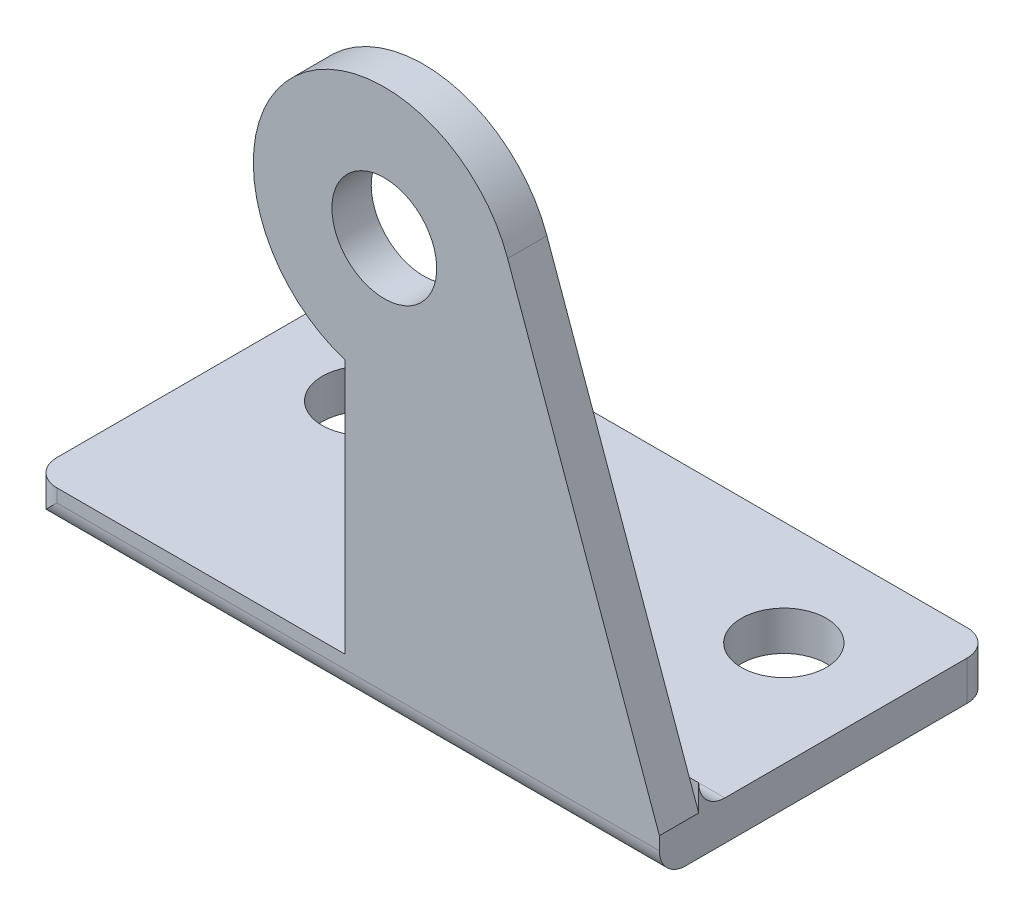
ISO-10303-21;
HEADER;
FILE_DESCRIPTION(('STEP AP214'),'2;1');
FILE_NAME('part.step','',(''),(''),'','','');
FILE_SCHEMA(('AUTOMOTIVE_DESIGN { 1 0 10303 214 1 1 1 1 }'));
ENDSEC;
DATA;
#1=APPLICATION_CONTEXT('core data for automotive mechanical design processes');
#2=APPLICATION_PROTOCOL_DEFINITION('international standard','automotive_design',2000,#1);
#3=PRODUCT_CONTEXT('',#1,'mechanical');
#4=PRODUCT('Part','Part','',(#3));
#5=PRODUCT_RELATED_PRODUCT_CATEGORY('part','',(#4));
#6=PRODUCT_DEFINITION_FORMATION('','',#4);
#7=PRODUCT_DEFINITION_CONTEXT('part definition',#1,'design');
#8=PRODUCT_DEFINITION('design','',#6,#7);
#9=PRODUCT_DEFINITION_SHAPE('','',#8);
#10=(LENGTH_UNIT() NAMED_UNIT(*) SI_UNIT(.MILLI.,.METRE.));
#11=(NAMED_UNIT(*) PLANE_ANGLE_UNIT() SI_UNIT($,.RADIAN.));
#12=(NAMED_UNIT(*) SI_UNIT($,.STERADIAN.) SOLID_ANGLE_UNIT());
#13=UNCERTAINTY_MEASURE_WITH_UNIT(LENGTH_MEASURE(1.E-05),#10,'distance_accuracy_value','');
#14=(GEOMETRIC_REPRESENTATION_CONTEXT(3) GLOBAL_UNCERTAINTY_ASSIGNED_CONTEXT((#13)) GLOBAL_UNIT_ASSIGNED_CONTEXT((#10,
#11,#12)) REPRESENTATION_CONTEXT('',''));
#15=CARTESIAN_POINT('',(0.,0.,0.));
#16=DIRECTION('',(0.,0.,1.));
#17=DIRECTION('',(1.,0.,0.));
#18=AXIS2_PLACEMENT_3D('',#15,#16,#17);
#19=CARTESIAN_POINT('',(191.145200006524,-32.,-20.6716658234497));
#20=DIRECTION('',(0.,1.,0.));
#21=DIRECTION('',(0.,0.,1.));
#22=AXIS2_PLACEMENT_3D('',#19,#20,#21);
#23=PLANE('',#22);
#24=DIRECTION('',(1.,0.,0.));
#25=VECTOR('',#24,1.);
#26=CARTESIAN_POINT('',(191.,-32.,-10.));
#27=LINE('',#26,#25);
#28=CARTESIAN_POINT('',(167.,-32.,-10.));
#29=VERTEX_POINT('',#28);
#30=CARTESIAN_POINT('',(215.,-32.,-10.));
#31=VERTEX_POINT('',#30);
#32=EDGE_CURVE('E204',#29,#31,#27,.T.);
#33=ORIENTED_EDGE('',*,*,#32,.F.);
#34=DIRECTION('',(0.,0.,1.));
#35=VECTOR('',#34,1.);
#36=CARTESIAN_POINT('',(167.,-32.,-31.5));
#37=LINE('',#36,#35);
#38=CARTESIAN_POINT('',(167.,-32.,-31.5));
#39=VERTEX_POINT('',#38);
#40=EDGE_CURVE('E11',#39,#29,#37,.T.);
#41=ORIENTED_EDGE('',*,*,#40,.F.);
#42=CARTESIAN_POINT('',(169.,-32.,-31.5));
#43=DIRECTION('',(0.,1.,0.));
#44=DIRECTION('',(0.,0.,1.));
#45=AXIS2_PLACEMENT_3D('',#42,#43,#44);
#46=CIRCLE('',#45,2.);
#47=CARTESIAN_POINT('',(169.,-32.,-33.5));
#48=VERTEX_POINT('',#47);
#49=EDGE_CURVE('E178',#48,#39,#46,.T.);
#50=ORIENTED_EDGE('',*,*,#49,.F.);
#51=DIRECTION('',(-1.,0.,0.));
#52=VECTOR('',#51,1.);
#53=CARTESIAN_POINT('',(213.,-32.,-33.5));
#54=LINE('',#53,#52);
#55=CARTESIAN_POINT('',(213.,-32.,-33.5));
#56=VERTEX_POINT('',#55);
#57=EDGE_CURVE('E171',#56,#48,#54,.T.);
#58=ORIENTED_EDGE('',*,*,#57,.F.);
#59=CARTESIAN_POINT('',(213.,-32.,-31.5));
#60=DIRECTION('',(0.,1.,0.));
#61=DIRECTION('',(0.,0.,1.));
#62=AXIS2_PLACEMENT_3D('',#59,#60,#61);
#63=CIRCLE('',#62,2.);
#64=CARTESIAN_POINT('',(215.,-32.,-31.5));
#65=VERTEX_POINT('',#64);
#66=EDGE_CURVE('E37',#65,#56,#63,.T.);
#67=ORIENTED_EDGE('',*,*,#66,.F.);
#68=DIRECTION('',(0.,0.,1.));
#69=VECTOR('',#68,1.);
#70=CARTESIAN_POINT('',(215.,-32.,-31.5));
#71=LINE('',#70,#69);
#72=EDGE_CURVE('E24',#65,#31,#71,.T.);
#73=ORIENTED_EDGE('',*,*,#72,.T.);
#74=EDGE_LOOP('',(#33,#41,#50,#58,#67,#73));
#75=FACE_BOUND('',#74,.T.);
#76=CARTESIAN_POINT('',(207.,-32.,-25.5));
#77=DIRECTION('',(0.,1.,0.));
#78=DIRECTION('',(1.,0.,0.));
#79=AXIS2_PLACEMENT_3D('',#76,#77,#78);
#80=CIRCLE('',#79,3.25);
#81=CARTESIAN_POINT('',(203.75,-32.,-25.5));
#82=VERTEX_POINT('',#81);
#83=EDGE_CURVE('E131',#82,#82,#80,.T.);
#84=ORIENTED_EDGE('',*,*,#83,.T.);
#85=EDGE_LOOP('',(#84));
#86=FACE_BOUND('',#85,.T.);
#87=CARTESIAN_POINT('',(175.,-32.,-25.5));
#88=DIRECTION('',(0.,1.,0.));
#89=DIRECTION('',(1.,0.,0.));
#90=AXIS2_PLACEMENT_3D('',#87,#88,#89);
#91=CIRCLE('',#90,3.25);
#92=CARTESIAN_POINT('',(171.75,-32.,-25.5));
#93=VERTEX_POINT('',#92);
#94=EDGE_CURVE('E146',#93,#93,#91,.T.);
#95=ORIENTED_EDGE('',*,*,#94,.T.);
#96=EDGE_LOOP('',(#95));
#97=FACE_BOUND('',#96,.T.);
#98=ADVANCED_FACE('F17',(#75,#86,#97),#23,.F.);
#99=CARTESIAN_POINT('',(167.,-32.,-20.75));
#100=DIRECTION('',(-1.,0.,0.));
#101=DIRECTION('',(0.,0.,1.));
#102=AXIS2_PLACEMENT_3D('',#99,#100,#101);
#103=PLANE('',#102);
#104=DIRECTION('',(0.,0.,-1.));
#105=VECTOR('',#104,1.);
#106=CARTESIAN_POINT('',(167.,-29.,-31.5));
#107=LINE('',#106,#105);
#108=CARTESIAN_POINT('',(167.,-29.,-10.));
#109=VERTEX_POINT('',#108);
#110=CARTESIAN_POINT('',(167.,-29.,-31.5));
#111=VERTEX_POINT('',#110);
#112=EDGE_CURVE('E192',#109,#111,#107,.T.);
#113=ORIENTED_EDGE('',*,*,#112,.T.);
#114=DIRECTION('',(0.,1.,0.));
#115=VECTOR('',#114,1.);
#116=CARTESIAN_POINT('',(167.,-32.,-31.5));
#117=LINE('',#116,#115);
#118=EDGE_CURVE('E184',#39,#111,#117,.T.);
#119=ORIENTED_EDGE('',*,*,#118,.F.);
#120=ORIENTED_EDGE('',*,*,#40,.T.);
#121=DIRECTION('',(0.,1.,0.));
#122=VECTOR('',#121,1.);
#123=CARTESIAN_POINT('',(167.,-32.,-10.));
#124=LINE('',#123,#122);
#125=EDGE_CURVE('E214',#29,#109,#124,.T.);
#126=ORIENTED_EDGE('',*,*,#125,.T.);
#127=EDGE_LOOP('',(#113,#119,#120,#126));
#128=FACE_BOUND('',#127,.T.);
#129=ADVANCED_FACE('F253',(#128),#103,.T.);
#130=CARTESIAN_POINT('',(215.,-32.,-19.75));
#131=DIRECTION('',(1.,0.,0.));
#132=DIRECTION('',(0.,0.,-1.));
#133=AXIS2_PLACEMENT_3D('',#130,#131,#132);
#134=PLANE('',#133);
#135=CARTESIAN_POINT('',(215.,-30.,-10.));
#136=DIRECTION('',(1.,0.,0.));
#137=DIRECTION('',(0.,-1.,0.));
#138=AXIS2_PLACEMENT_3D('',#135,#136,#137);
#139=CIRCLE('',#138,2.);
#140=CARTESIAN_POINT('',(215.,-30.,-8.));
#141=VERTEX_POINT('',#140);
#142=EDGE_CURVE('E207',#141,#31,#139,.T.);
#143=ORIENTED_EDGE('',*,*,#142,.T.);
#144=ORIENTED_EDGE('',*,*,#72,.F.);
#145=DIRECTION('',(0.,1.,0.));
#146=VECTOR('',#145,1.);
#147=CARTESIAN_POINT('',(215.,-32.,-31.5));
#148=LINE('',#147,#146);
#149=CARTESIAN_POINT('',(215.,-29.,-31.5));
#150=VERTEX_POINT('',#149);
#151=EDGE_CURVE('E173',#65,#150,#148,.T.);
#152=ORIENTED_EDGE('',*,*,#151,.T.);
#153=DIRECTION('',(0.,0.,1.));
#154=VECTOR('',#153,1.);
#155=CARTESIAN_POINT('',(215.,-29.,-31.5));
#156=LINE('',#155,#154);
#157=CARTESIAN_POINT('',(215.,-29.,-13.));
#158=VERTEX_POINT('',#157);
#159=EDGE_CURVE('E145',#150,#158,#156,.T.);
#160=ORIENTED_EDGE('',*,*,#159,.T.);
#161=CARTESIAN_POINT('',(215.,-27.,-13.));
#162=DIRECTION('',(-1.,0.,0.));
#163=DIRECTION('',(0.,0.,1.));
#164=AXIS2_PLACEMENT_3D('',#161,#162,#163);
#165=CIRCLE('',#164,2.);
#166=CARTESIAN_POINT('',(215.,-27.,-11.));
#167=VERTEX_POINT('',#166);
#168=EDGE_CURVE('E170',#158,#167,#165,.T.);
#169=ORIENTED_EDGE('',*,*,#168,.T.);
#170=DIRECTION('',(0.,-1.,0.));
#171=VECTOR('',#170,1.);
#172=CARTESIAN_POINT('',(215.,-27.,-11.));
#173=LINE('',#172,#171);
#174=CARTESIAN_POINT('',(215.,-29.,-11.));
#175=VERTEX_POINT('',#174);
#176=EDGE_CURVE('E134',#167,#175,#173,.T.);
#177=ORIENTED_EDGE('',*,*,#176,.T.);
#178=DIRECTION('',(0.,0.,1.));
#179=VECTOR('',#178,1.);
#180=CARTESIAN_POINT('',(215.,-29.,-31.5));
#181=LINE('',#180,#179);
#182=CARTESIAN_POINT('',(215.,-29.,-8.));
#183=VERTEX_POINT('',#182);
#184=EDGE_CURVE('E179',#175,#183,#181,.T.);
#185=ORIENTED_EDGE('',*,*,#184,.T.);
#186=DIRECTION('',(0.,1.,0.));
#187=VECTOR('',#186,1.);
#188=CARTESIAN_POINT('',(215.,-32.,-8.));
#189=LINE('',#188,#187);
#190=EDGE_CURVE('E216',#141,#183,#189,.T.);
#191=ORIENTED_EDGE('',*,*,#190,.F.);
#192=EDGE_LOOP('',(#143,#144,#152,#160,#169,#177,#185,#191));
#193=FACE_BOUND('',#192,.T.);
#194=ADVANCED_FACE('F243',(#193),#134,.T.);
#195=CARTESIAN_POINT('',(213.,-32.,-31.5));
#196=DIRECTION('',(0.,-1.,0.));
#197=DIRECTION('',(0.,0.,1.));
#198=AXIS2_PLACEMENT_3D('',#195,#196,#197);
#199=CYLINDRICAL_SURFACE('',#198,2.);
#200=CARTESIAN_POINT('',(213.,-29.,-31.5));
#201=DIRECTION('',(0.,-1.,0.));
#202=DIRECTION('',(0.,0.,1.));
#203=AXIS2_PLACEMENT_3D('',#200,#201,#202);
#204=CIRCLE('',#203,2.);
#205=CARTESIAN_POINT('',(213.,-29.,-33.5));
#206=VERTEX_POINT('',#205);
#207=EDGE_CURVE('E141',#206,#150,#204,.T.);
#208=ORIENTED_EDGE('',*,*,#207,.T.);
#209=ORIENTED_EDGE('',*,*,#151,.F.);
#210=ORIENTED_EDGE('',*,*,#66,.T.);
#211=DIRECTION('',(0.,1.,0.));
#212=VECTOR('',#211,1.);
#213=CARTESIAN_POINT('',(213.,-32.,-33.5));
#214=LINE('',#213,#212);
#215=EDGE_CURVE('E174',#56,#206,#214,.T.);
#216=ORIENTED_EDGE('',*,*,#215,.T.);
#217=EDGE_LOOP('',(#208,#209,#210,#216));
#218=FACE_BOUND('',#217,.T.);
#219=ADVANCED_FACE('F265',(#218),#199,.T.);
#220=CARTESIAN_POINT('',(191.,-32.,-33.5));
#221=DIRECTION('',(0.,0.,-1.));
#222=DIRECTION('',(-1.,0.,0.));
#223=AXIS2_PLACEMENT_3D('',#220,#221,#222);
#224=PLANE('',#223);
#225=DIRECTION('',(1.,0.,0.));
#226=VECTOR('',#225,1.);
#227=CARTESIAN_POINT('',(213.,-29.,-33.5));
#228=LINE('',#227,#226);
#229=CARTESIAN_POINT('',(169.,-29.,-33.5));
#230=VERTEX_POINT('',#229);
#231=EDGE_CURVE('E144',#230,#206,#228,.T.);
#232=ORIENTED_EDGE('',*,*,#231,.T.);
#233=ORIENTED_EDGE('',*,*,#215,.F.);
#234=ORIENTED_EDGE('',*,*,#57,.T.);
#235=DIRECTION('',(0.,1.,0.));
#236=VECTOR('',#235,1.);
#237=CARTESIAN_POINT('',(169.,-32.,-33.5));
#238=LINE('',#237,#236);
#239=EDGE_CURVE('E176',#48,#230,#238,.T.);
#240=ORIENTED_EDGE('',*,*,#239,.T.);
#241=EDGE_LOOP('',(#232,#233,#234,#240));
#242=FACE_BOUND('',#241,.T.);
#243=ADVANCED_FACE('F263',(#242),#224,.T.);
#244=CARTESIAN_POINT('',(169.,-32.,-31.5));
#245=DIRECTION('',(0.,-1.,0.));
#246=DIRECTION('',(0.,0.,1.));
#247=AXIS2_PLACEMENT_3D('',#244,#245,#246);
#248=CYLINDRICAL_SURFACE('',#247,2.);
#249=CARTESIAN_POINT('',(169.,-29.,-31.5));
#250=DIRECTION('',(0.,-1.,0.));
#251=DIRECTION('',(0.,0.,1.));
#252=AXIS2_PLACEMENT_3D('',#249,#250,#251);
#253=CIRCLE('',#252,2.);
#254=EDGE_CURVE('E189',#111,#230,#253,.T.);
#255=ORIENTED_EDGE('',*,*,#254,.T.);
#256=ORIENTED_EDGE('',*,*,#239,.F.);
#257=ORIENTED_EDGE('',*,*,#49,.T.);
#258=ORIENTED_EDGE('',*,*,#118,.T.);
#259=EDGE_LOOP('',(#255,#256,#257,#258));
#260=FACE_BOUND('',#259,.T.);
#261=ADVANCED_FACE('F260',(#260),#248,.T.);
#262=CARTESIAN_POINT('',(209.20759196328,-12.8151920265905,-11.));
#263=DIRECTION('',(0.941518392655946,0.336961594681891,0.));
#264=DIRECTION('',(-0.336961594681891,0.941518392655946,0.));
#265=AXIS2_PLACEMENT_3D('',#262,#263,#264);
#266=PLANE('',#265);
#267=DIRECTION('',(0.336961594681891,-0.941518392655946,0.));
#268=VECTOR('',#267,1.);
#269=CARTESIAN_POINT('',(215.,-29.,-8.));
#270=LINE('',#269,#268);
#271=CARTESIAN_POINT('',(203.41518392656,3.36961594681892,-8.));
#272=VERTEX_POINT('',#271);
#273=EDGE_CURVE('E219',#272,#183,#270,.T.);
#274=ORIENTED_EDGE('',*,*,#273,.T.);
#275=ORIENTED_EDGE('',*,*,#184,.F.);
#276=DIRECTION('',(-0.336961594681891,0.941518392655946,0.));
#277=VECTOR('',#276,1.);
#278=CARTESIAN_POINT('',(215.,-29.,-11.));
#279=LINE('',#278,#277);
#280=CARTESIAN_POINT('',(214.284216649807,-27.,-11.));
#281=VERTEX_POINT('',#280);
#282=EDGE_CURVE('E130',#175,#281,#279,.T.);
#283=ORIENTED_EDGE('',*,*,#282,.T.);
#284=DIRECTION('',(-0.336961594681891,0.941518392655946,0.));
#285=VECTOR('',#284,1.);
#286=CARTESIAN_POINT('',(215.,-29.,-11.));
#287=LINE('',#286,#285);
#288=CARTESIAN_POINT('',(203.41518392656,3.36961594681892,-11.));
#289=VERTEX_POINT('',#288);
#290=EDGE_CURVE('E167',#281,#289,#287,.T.);
#291=ORIENTED_EDGE('',*,*,#290,.T.);
#292=DIRECTION('',(0.,0.,1.));
#293=VECTOR('',#292,1.);
#294=CARTESIAN_POINT('',(203.41518392656,3.36961594681892,-11.));
#295=LINE('',#294,#293);
#296=EDGE_CURVE('E232',#289,#272,#295,.T.);
#297=ORIENTED_EDGE('',*,*,#296,.T.);
#298=EDGE_LOOP('',(#274,#275,#283,#291,#297));
#299=FACE_BOUND('',#298,.T.);
#300=ADVANCED_FACE('F280',(#299),#266,.T.);
#301=CARTESIAN_POINT('',(194.,0.,-11.));
#302=DIRECTION('',(0.,0.,-1.));
#303=DIRECTION('',(1.,0.,0.));
#304=AXIS2_PLACEMENT_3D('',#301,#302,#303);
#305=CYLINDRICAL_SURFACE('',#304,10.);
#306=CARTESIAN_POINT('',(194.,0.,-8.));
#307=DIRECTION('',(0.,0.,-1.));
#308=DIRECTION('',(1.,0.,0.));
#309=AXIS2_PLACEMENT_3D('',#306,#307,#308);
#310=CIRCLE('',#309,10.);
#311=CARTESIAN_POINT('',(191.,-9.53939201416945,-8.));
#312=VERTEX_POINT('',#311);
#313=EDGE_CURVE('E222',#312,#272,#310,.T.);
#314=ORIENTED_EDGE('',*,*,#313,.T.);
#315=ORIENTED_EDGE('',*,*,#296,.F.);
#316=CARTESIAN_POINT('',(194.,0.,-11.));
#317=DIRECTION('',(0.,0.,1.));
#318=DIRECTION('',(1.,0.,0.));
#319=AXIS2_PLACEMENT_3D('',#316,#317,#318);
#320=CIRCLE('',#319,10.);
#321=CARTESIAN_POINT('',(191.,-9.53939201416945,-11.));
#322=VERTEX_POINT('',#321);
#323=EDGE_CURVE('E151',#289,#322,#320,.T.);
#324=ORIENTED_EDGE('',*,*,#323,.T.);
#325=DIRECTION('',(0.,0.,1.));
#326=VECTOR('',#325,1.);
#327=CARTESIAN_POINT('',(191.,-9.53939201416945,-11.));
#328=LINE('',#327,#326);
#329=EDGE_CURVE('E230',#322,#312,#328,.T.);
#330=ORIENTED_EDGE('',*,*,#329,.T.);
#331=EDGE_LOOP('',(#314,#315,#324,#330));
#332=FACE_BOUND('',#331,.T.);
#333=ADVANCED_FACE('F294',(#332),#305,.T.);
#334=CARTESIAN_POINT('',(191.,-19.2696960070848,-11.));
#335=DIRECTION('',(-1.,0.,0.));
#336=DIRECTION('',(0.,-1.,0.));
#337=AXIS2_PLACEMENT_3D('',#334,#335,#336);
#338=PLANE('',#337);
#339=DIRECTION('',(0.,1.,0.));
#340=VECTOR('',#339,1.);
#341=CARTESIAN_POINT('',(191.,-29.,-8.));
#342=LINE('',#341,#340);
#343=CARTESIAN_POINT('',(191.,-29.,-8.));
#344=VERTEX_POINT('',#343);
#345=EDGE_CURVE('E225',#344,#312,#342,.T.);
#346=ORIENTED_EDGE('',*,*,#345,.T.);
#347=ORIENTED_EDGE('',*,*,#329,.F.);
#348=DIRECTION('',(0.,1.,0.));
#349=VECTOR('',#348,1.);
#350=CARTESIAN_POINT('',(191.,-29.,-11.));
#351=LINE('',#350,#349);
#352=CARTESIAN_POINT('',(191.,-27.,-11.));
#353=VERTEX_POINT('',#352);
#354=EDGE_CURVE('E148',#353,#322,#351,.T.);
#355=ORIENTED_EDGE('',*,*,#354,.F.);
#356=CARTESIAN_POINT('',(191.,-27.,-13.));
#357=DIRECTION('',(-1.,0.,0.));
#358=DIRECTION('',(0.,0.,1.));
#359=AXIS2_PLACEMENT_3D('',#356,#357,#358);
#360=CIRCLE('',#359,2.);
#361=CARTESIAN_POINT('',(191.,-29.,-13.));
#362=VERTEX_POINT('',#361);
#363=EDGE_CURVE('E158',#362,#353,#360,.T.);
#364=ORIENTED_EDGE('',*,*,#363,.F.);
#365=DIRECTION('',(0.,0.,-1.));
#366=VECTOR('',#365,1.);
#367=CARTESIAN_POINT('',(191.,-29.,-15.8358329117249));
#368=LINE('',#367,#366);
#369=EDGE_CURVE('E162',#344,#362,#368,.T.);
#370=ORIENTED_EDGE('',*,*,#369,.F.);
#371=EDGE_LOOP('',(#346,#347,#355,#364,#370));
#372=FACE_BOUND('',#371,.T.);
#373=ADVANCED_FACE('F290',(#372),#338,.T.);
#374=CARTESIAN_POINT('',(194.,0.,-9.5));
#375=DIRECTION('',(0.,0.,-1.));
#376=DIRECTION('',(1.,0.,0.));
#377=AXIS2_PLACEMENT_3D('',#374,#375,#376);
#378=CYLINDRICAL_SURFACE('',#377,4.);
#379=CARTESIAN_POINT('',(194.,0.,-8.));
#380=DIRECTION('',(0.,0.,-1.));
#381=DIRECTION('',(1.,0.,0.));
#382=AXIS2_PLACEMENT_3D('',#379,#380,#381);
#383=CIRCLE('',#382,4.);
#384=CARTESIAN_POINT('',(190.,0.,-8.));
#385=VERTEX_POINT('',#384);
#386=EDGE_CURVE('E228',#385,#385,#383,.T.);
#387=ORIENTED_EDGE('',*,*,#386,.F.);
#388=EDGE_LOOP('',(#387));
#389=FACE_BOUND('',#388,.T.);
#390=CARTESIAN_POINT('',(194.,0.,-11.));
#391=DIRECTION('',(0.,0.,1.));
#392=DIRECTION('',(1.,0.,0.));
#393=AXIS2_PLACEMENT_3D('',#390,#391,#392);
#394=CIRCLE('',#393,4.);
#395=CARTESIAN_POINT('',(190.,0.,-11.));
#396=VERTEX_POINT('',#395);
#397=EDGE_CURVE('E164',#396,#396,#394,.T.);
#398=ORIENTED_EDGE('',*,*,#397,.F.);
#399=EDGE_LOOP('',(#398));
#400=FACE_BOUND('',#399,.T.);
#401=ADVANCED_FACE('F302',(#389,#400),#378,.F.);
#402=CARTESIAN_POINT('',(192.,-32.,-8.));
#403=DIRECTION('',(0.,0.,1.));
#404=DIRECTION('',(1.,0.,0.));
#405=AXIS2_PLACEMENT_3D('',#402,#403,#404);
#406=PLANE('',#405);
#407=ORIENTED_EDGE('',*,*,#386,.T.);
#408=EDGE_LOOP('',(#407));
#409=FACE_BOUND('',#408,.T.);
#410=DIRECTION('',(1.,0.,0.));
#411=VECTOR('',#410,1.);
#412=CARTESIAN_POINT('',(192.,-30.,-8.));
#413=LINE('',#412,#411);
#414=CARTESIAN_POINT('',(169.,-30.,-8.));
#415=VERTEX_POINT('',#414);
#416=EDGE_CURVE('E209',#415,#141,#413,.T.);
#417=ORIENTED_EDGE('',*,*,#416,.T.);
#418=ORIENTED_EDGE('',*,*,#190,.T.);
#419=ORIENTED_EDGE('',*,*,#273,.F.);
#420=ORIENTED_EDGE('',*,*,#313,.F.);
#421=ORIENTED_EDGE('',*,*,#345,.F.);
#422=DIRECTION('',(-1.,0.,0.));
#423=VECTOR('',#422,1.);
#424=CARTESIAN_POINT('',(169.,-29.,-8.));
#425=LINE('',#424,#423);
#426=CARTESIAN_POINT('',(169.,-29.,-8.));
#427=VERTEX_POINT('',#426);
#428=EDGE_CURVE('E198',#344,#427,#425,.T.);
#429=ORIENTED_EDGE('',*,*,#428,.T.);
#430=DIRECTION('',(0.,1.,0.));
#431=VECTOR('',#430,1.);
#432=CARTESIAN_POINT('',(169.,-32.,-8.));
#433=LINE('',#432,#431);
#434=EDGE_CURVE('E212',#415,#427,#433,.T.);
#435=ORIENTED_EDGE('',*,*,#434,.F.);
#436=EDGE_LOOP('',(#417,#418,#419,#420,#421,#429,#435));
#437=FACE_BOUND('',#436,.T.);
#438=ADVANCED_FACE('F285',(#409,#437),#406,.T.);
#439=CARTESIAN_POINT('',(169.,-32.,-10.));
#440=DIRECTION('',(0.,-1.,0.));
#441=DIRECTION('',(0.,0.,1.));
#442=AXIS2_PLACEMENT_3D('',#439,#440,#441);
#443=CYLINDRICAL_SURFACE('',#442,2.);
#444=CARTESIAN_POINT('',(169.,-30.,-10.));
#445=DIRECTION('',(-0.707106781186548,0.707106781186548,0.));
#446=DIRECTION('',(-0.707106781186548,-0.707106781186548,0.));
#447=AXIS2_PLACEMENT_3D('',#444,#445,#446);
#448=ELLIPSE('',#447,2.82842712474619,2.);
#449=EDGE_CURVE('E201',#29,#415,#448,.T.);
#450=ORIENTED_EDGE('',*,*,#449,.T.);
#451=ORIENTED_EDGE('',*,*,#434,.T.);
#452=CARTESIAN_POINT('',(169.,-29.,-10.));
#453=DIRECTION('',(0.,-1.,0.));
#454=DIRECTION('',(0.,0.,1.));
#455=AXIS2_PLACEMENT_3D('',#452,#453,#454);
#456=CIRCLE('',#455,2.);
#457=EDGE_CURVE('E195',#427,#109,#456,.T.);
#458=ORIENTED_EDGE('',*,*,#457,.T.);
#459=ORIENTED_EDGE('',*,*,#125,.F.);
#460=EDGE_LOOP('',(#450,#451,#458,#459));
#461=FACE_BOUND('',#460,.T.);
#462=ADVANCED_FACE('F249',(#461),#443,.T.);
#463=CARTESIAN_POINT('',(216.,-30.,-10.));
#464=DIRECTION('',(1.,0.,0.));
#465=DIRECTION('',(0.,-1.,0.));
#466=AXIS2_PLACEMENT_3D('',#463,#464,#465);
#467=CYLINDRICAL_SURFACE('',#466,2.);
#468=ORIENTED_EDGE('',*,*,#449,.F.);
#469=ORIENTED_EDGE('',*,*,#32,.T.);
#470=ORIENTED_EDGE('',*,*,#142,.F.);
#471=ORIENTED_EDGE('',*,*,#416,.F.);
#472=EDGE_LOOP('',(#468,#469,#470,#471));
#473=FACE_BOUND('',#472,.T.);
#474=ADVANCED_FACE('F246',(#473),#467,.T.);
#475=CARTESIAN_POINT('',(191.145200006524,-29.,-20.6716658234497));
#476=DIRECTION('',(0.,1.,0.));
#477=DIRECTION('',(0.,0.,1.));
#478=AXIS2_PLACEMENT_3D('',#475,#476,#477);
#479=PLANE('',#478);
#480=ORIENTED_EDGE('',*,*,#369,.T.);
#481=DIRECTION('',(1.,0.,0.));
#482=VECTOR('',#481,1.);
#483=CARTESIAN_POINT('',(203.,-29.,-13.));
#484=LINE('',#483,#482);
#485=EDGE_CURVE('E140',#362,#158,#484,.T.);
#486=ORIENTED_EDGE('',*,*,#485,.T.);
#487=ORIENTED_EDGE('',*,*,#159,.F.);
#488=ORIENTED_EDGE('',*,*,#207,.F.);
#489=ORIENTED_EDGE('',*,*,#231,.F.);
#490=ORIENTED_EDGE('',*,*,#254,.F.);
#491=ORIENTED_EDGE('',*,*,#112,.F.);
#492=ORIENTED_EDGE('',*,*,#457,.F.);
#493=ORIENTED_EDGE('',*,*,#428,.F.);
#494=EDGE_LOOP('',(#480,#486,#487,#488,#489,#490,#491,#492,#493));
#495=FACE_BOUND('',#494,.T.);
#496=CARTESIAN_POINT('',(207.,-29.,-25.5));
#497=DIRECTION('',(0.,-1.,0.));
#498=DIRECTION('',(1.,0.,0.));
#499=AXIS2_PLACEMENT_3D('',#496,#497,#498);
#500=CIRCLE('',#499,3.25);
#501=CARTESIAN_POINT('',(203.75,-29.,-25.5));
#502=VERTEX_POINT('',#501);
#503=EDGE_CURVE('E126',#502,#502,#500,.T.);
#504=ORIENTED_EDGE('',*,*,#503,.T.);
#505=EDGE_LOOP('',(#504));
#506=FACE_BOUND('',#505,.T.);
#507=CARTESIAN_POINT('',(175.,-29.,-25.5));
#508=DIRECTION('',(0.,-1.,0.));
#509=DIRECTION('',(1.,0.,0.));
#510=AXIS2_PLACEMENT_3D('',#507,#508,#509);
#511=CIRCLE('',#510,3.25);
#512=CARTESIAN_POINT('',(171.75,-29.,-25.5));
#513=VERTEX_POINT('',#512);
#514=EDGE_CURVE('E136',#513,#513,#511,.T.);
#515=ORIENTED_EDGE('',*,*,#514,.T.);
#516=EDGE_LOOP('',(#515));
#517=FACE_BOUND('',#516,.T.);
#518=ADVANCED_FACE('F127',(#495,#506,#517),#479,.T.);
#519=CARTESIAN_POINT('',(198.866389571378,-11.9148205846463,-11.));
#520=DIRECTION('',(0.,0.,1.));
#521=DIRECTION('',(1.,0.,0.));
#522=AXIS2_PLACEMENT_3D('',#519,#520,#521);
#523=PLANE('',#522);
#524=ORIENTED_EDGE('',*,*,#397,.T.);
#525=EDGE_LOOP('',(#524));
#526=FACE_BOUND('',#525,.T.);
#527=DIRECTION('',(1.,0.,0.));
#528=VECTOR('',#527,1.);
#529=CARTESIAN_POINT('',(203.,-27.,-11.));
#530=LINE('',#529,#528);
#531=EDGE_CURVE('E161',#353,#281,#530,.T.);
#532=ORIENTED_EDGE('',*,*,#531,.F.);
#533=ORIENTED_EDGE('',*,*,#354,.T.);
#534=ORIENTED_EDGE('',*,*,#323,.F.);
#535=ORIENTED_EDGE('',*,*,#290,.F.);
#536=EDGE_LOOP('',(#532,#533,#534,#535));
#537=FACE_BOUND('',#536,.T.);
#538=ADVANCED_FACE('F292',(#526,#537),#523,.F.);
#539=CARTESIAN_POINT('',(215.,-27.,-13.));
#540=DIRECTION('',(1.,0.,0.));
#541=DIRECTION('',(0.,0.,1.));
#542=AXIS2_PLACEMENT_3D('',#539,#540,#541);
#543=CYLINDRICAL_SURFACE('',#542,2.);
#544=ORIENTED_EDGE('',*,*,#363,.T.);
#545=ORIENTED_EDGE('',*,*,#531,.T.);
#546=DIRECTION('',(-1.,0.,0.));
#547=VECTOR('',#546,1.);
#548=CARTESIAN_POINT('',(215.,-27.,-11.));
#549=LINE('',#548,#547);
#550=EDGE_CURVE('E154',#167,#281,#549,.T.);
#551=ORIENTED_EDGE('',*,*,#550,.F.);
#552=ORIENTED_EDGE('',*,*,#168,.F.);
#553=ORIENTED_EDGE('',*,*,#485,.F.);
#554=EDGE_LOOP('',(#544,#545,#551,#552,#553));
#555=FACE_BOUND('',#554,.T.);
#556=ADVANCED_FACE('F275',(#555),#543,.F.);
#557=CARTESIAN_POINT('',(215.,-28.,-11.));
#558=DIRECTION('',(0.,0.,1.));
#559=DIRECTION('',(0.,1.,0.));
#560=AXIS2_PLACEMENT_3D('',#557,#558,#559);
#561=PLANE('',#560);
#562=ORIENTED_EDGE('',*,*,#282,.F.);
#563=ORIENTED_EDGE('',*,*,#176,.F.);
#564=ORIENTED_EDGE('',*,*,#550,.T.);
#565=EDGE_LOOP('',(#562,#563,#564));
#566=FACE_BOUND('',#565,.T.);
#567=ADVANCED_FACE('F278',(#566),#561,.T.);
#568=CARTESIAN_POINT('',(207.,-30.5,-25.5));
#569=DIRECTION('',(0.,1.,0.));
#570=DIRECTION('',(1.,0.,0.));
#571=AXIS2_PLACEMENT_3D('',#568,#569,#570);
#572=CYLINDRICAL_SURFACE('',#571,3.25);
#573=ORIENTED_EDGE('',*,*,#503,.F.);
#574=EDGE_LOOP('',(#573));
#575=FACE_BOUND('',#574,.T.);
#576=ORIENTED_EDGE('',*,*,#83,.F.);
#577=EDGE_LOOP('',(#576));
#578=FACE_BOUND('',#577,.T.);
#579=ADVANCED_FACE('F341',(#575,#578),#572,.F.);
#580=CARTESIAN_POINT('',(175.,-30.5,-25.5));
#581=DIRECTION('',(0.,1.,0.));
#582=DIRECTION('',(1.,0.,0.));
#583=AXIS2_PLACEMENT_3D('',#580,#581,#582);
#584=CYLINDRICAL_SURFACE('',#583,3.25);
#585=ORIENTED_EDGE('',*,*,#514,.F.);
#586=EDGE_LOOP('',(#585));
#587=FACE_BOUND('',#586,.T.);
#588=ORIENTED_EDGE('',*,*,#94,.F.);
#589=EDGE_LOOP('',(#588));
#590=FACE_BOUND('',#589,.T.);
#591=ADVANCED_FACE('F344',(#587,#590),#584,.F.);
#592=CLOSED_SHELL('',(#98,#129,#194,#219,#243,#261,#300,#333,#373,#401,#438,#462,#474,#518,#538,
#556,#567,#579,#591));
#593=MANIFOLD_SOLID_BREP('B1',#592);
#594=ADVANCED_BREP_SHAPE_REPRESENTATION('',(#18,#593),#14);
#595=SHAPE_DEFINITION_REPRESENTATION(#9,#594);
ENDSEC;
END-ISO-10303-21;
